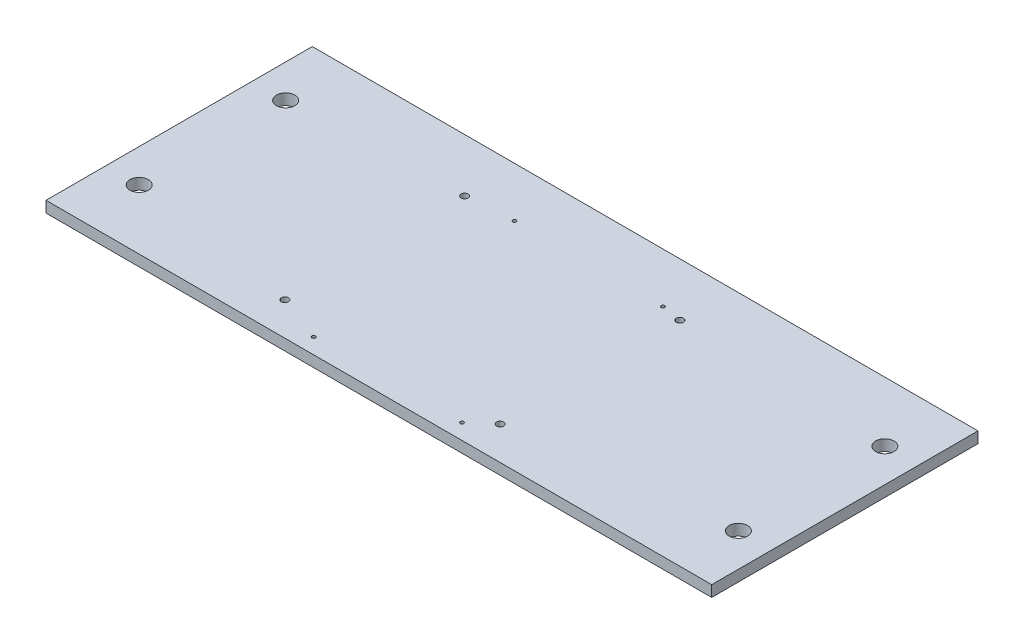
ISO-10303-21;
HEADER;
FILE_DESCRIPTION(('STEP AP214'),'2;1');
FILE_NAME('part.step','',(''),(''),'','','');
FILE_SCHEMA(('AUTOMOTIVE_DESIGN { 1 0 10303 214 1 1 1 1 }'));
ENDSEC;
DATA;
#1=APPLICATION_CONTEXT('core data for automotive mechanical design processes');
#2=APPLICATION_PROTOCOL_DEFINITION('international standard','automotive_design',2000,#1);
#3=PRODUCT_CONTEXT('',#1,'mechanical');
#4=PRODUCT('Part','Part','',(#3));
#5=PRODUCT_RELATED_PRODUCT_CATEGORY('part','',(#4));
#6=PRODUCT_DEFINITION_FORMATION('','',#4);
#7=PRODUCT_DEFINITION_CONTEXT('part definition',#1,'design');
#8=PRODUCT_DEFINITION('design','',#6,#7);
#9=PRODUCT_DEFINITION_SHAPE('','',#8);
#10=(LENGTH_UNIT() NAMED_UNIT(*) SI_UNIT(.MILLI.,.METRE.));
#11=(NAMED_UNIT(*) PLANE_ANGLE_UNIT() SI_UNIT($,.RADIAN.));
#12=(NAMED_UNIT(*) SI_UNIT($,.STERADIAN.) SOLID_ANGLE_UNIT());
#13=UNCERTAINTY_MEASURE_WITH_UNIT(LENGTH_MEASURE(1.E-05),#10,'distance_accuracy_value','');
#14=(GEOMETRIC_REPRESENTATION_CONTEXT(3) GLOBAL_UNCERTAINTY_ASSIGNED_CONTEXT((#13)) GLOBAL_UNIT_ASSIGNED_CONTEXT((#10,
#11,#12)) REPRESENTATION_CONTEXT('',''));
#15=CARTESIAN_POINT('',(0.,0.,0.));
#16=DIRECTION('',(0.,0.,1.));
#17=DIRECTION('',(1.,0.,0.));
#18=AXIS2_PLACEMENT_3D('',#15,#16,#17);
#19=CARTESIAN_POINT('',(0.,5.,0.));
#20=DIRECTION('',(0.,1.,0.));
#21=DIRECTION('',(0.,0.,1.));
#22=AXIS2_PLACEMENT_3D('',#19,#20,#21);
#23=PLANE('',#22);
#24=CARTESIAN_POINT('',(285.,5.,27.));
#25=DIRECTION('',(0.,-1.,0.));
#26=DIRECTION('',(0.,0.,-1.));
#27=AXIS2_PLACEMENT_3D('',#24,#25,#26);
#28=CIRCLE('',#27,4.15000000000001);
#29=CARTESIAN_POINT('',(285.,5.,22.85));
#30=VERTEX_POINT('',#29);
#31=EDGE_CURVE('E169',#30,#30,#28,.T.);
#32=ORIENTED_EDGE('',*,*,#31,.T.);
#33=EDGE_LOOP('',(#32));
#34=FACE_BOUND('',#33,.T.);
#35=CARTESIAN_POINT('',(285.,5.,93.));
#36=DIRECTION('',(0.,1.,0.));
#37=DIRECTION('',(0.,0.,1.));
#38=AXIS2_PLACEMENT_3D('',#35,#36,#37);
#39=CIRCLE('',#38,4.15000000000001);
#40=CARTESIAN_POINT('',(285.,5.,97.15));
#41=VERTEX_POINT('',#40);
#42=EDGE_CURVE('E170',#41,#41,#39,.T.);
#43=ORIENTED_EDGE('',*,*,#42,.F.);
#44=EDGE_LOOP('',(#43));
#45=FACE_BOUND('',#44,.T.);
#46=CARTESIAN_POINT('',(15.,5.,27.));
#47=DIRECTION('',(0.,1.,0.));
#48=DIRECTION('',(0.,0.,1.));
#49=AXIS2_PLACEMENT_3D('',#46,#47,#48);
#50=CIRCLE('',#49,4.15);
#51=CARTESIAN_POINT('',(15.,5.,31.15));
#52=VERTEX_POINT('',#51);
#53=EDGE_CURVE('E160',#52,#52,#50,.T.);
#54=ORIENTED_EDGE('',*,*,#53,.F.);
#55=EDGE_LOOP('',(#54));
#56=FACE_BOUND('',#55,.T.);
#57=CARTESIAN_POINT('',(92.6418942759896,5.,105.));
#58=DIRECTION('',(0.,1.,0.));
#59=DIRECTION('',(0.,0.,1.));
#60=AXIS2_PLACEMENT_3D('',#57,#58,#59);
#61=CIRCLE('',#60,1.6);
#62=CARTESIAN_POINT('',(92.6418942759896,5.,106.6));
#63=VERTEX_POINT('',#62);
#64=EDGE_CURVE('E156',#63,#63,#61,.T.);
#65=ORIENTED_EDGE('',*,*,#64,.F.);
#66=EDGE_LOOP('',(#65));
#67=FACE_BOUND('',#66,.T.);
#68=CARTESIAN_POINT('',(92.6418942759896,5.,24.));
#69=DIRECTION('',(0.,1.,0.));
#70=DIRECTION('',(0.,0.,1.));
#71=AXIS2_PLACEMENT_3D('',#68,#69,#70);
#72=CIRCLE('',#71,1.6);
#73=CARTESIAN_POINT('',(92.6418942759896,5.,25.6));
#74=VERTEX_POINT('',#73);
#75=EDGE_CURVE('E150',#74,#74,#72,.T.);
#76=ORIENTED_EDGE('',*,*,#75,.F.);
#77=EDGE_LOOP('',(#76));
#78=FACE_BOUND('',#77,.T.);
#79=CARTESIAN_POINT('',(189.64189427599,5.,24.));
#80=DIRECTION('',(0.,1.,0.));
#81=DIRECTION('',(0.,0.,1.));
#82=AXIS2_PLACEMENT_3D('',#79,#80,#81);
#83=CIRCLE('',#82,1.59999999999999);
#84=CARTESIAN_POINT('',(189.64189427599,5.,25.6));
#85=VERTEX_POINT('',#84);
#86=EDGE_CURVE('E144',#85,#85,#83,.T.);
#87=ORIENTED_EDGE('',*,*,#86,.F.);
#88=EDGE_LOOP('',(#87));
#89=FACE_BOUND('',#88,.T.);
#90=CARTESIAN_POINT('',(189.64189427599,5.,105.));
#91=DIRECTION('',(0.,1.,0.));
#92=DIRECTION('',(0.,0.,1.));
#93=AXIS2_PLACEMENT_3D('',#90,#91,#92);
#94=CIRCLE('',#93,1.59999999999999);
#95=CARTESIAN_POINT('',(189.64189427599,5.,106.6));
#96=VERTEX_POINT('',#95);
#97=EDGE_CURVE('E138',#96,#96,#94,.T.);
#98=ORIENTED_EDGE('',*,*,#97,.F.);
#99=EDGE_LOOP('',(#98));
#100=FACE_BOUND('',#99,.T.);
#101=CARTESIAN_POINT('',(113.64189427599,5.,112.9946));
#102=DIRECTION('',(0.,1.,0.));
#103=DIRECTION('',(0.,0.,1.));
#104=AXIS2_PLACEMENT_3D('',#101,#102,#103);
#105=CIRCLE('',#104,0.799999999999995);
#106=CARTESIAN_POINT('',(113.64189427599,5.,113.7946));
#107=VERTEX_POINT('',#106);
#108=EDGE_CURVE('E132',#107,#107,#105,.T.);
#109=ORIENTED_EDGE('',*,*,#108,.F.);
#110=EDGE_LOOP('',(#109));
#111=FACE_BOUND('',#110,.T.);
#112=CARTESIAN_POINT('',(180.47449427599,5.,112.9946));
#113=DIRECTION('',(0.,1.,0.));
#114=DIRECTION('',(0.,0.,1.));
#115=AXIS2_PLACEMENT_3D('',#112,#113,#114);
#116=CIRCLE('',#115,0.799999999999995);
#117=CARTESIAN_POINT('',(180.47449427599,5.,113.7946));
#118=VERTEX_POINT('',#117);
#119=EDGE_CURVE('E126',#118,#118,#116,.T.);
#120=ORIENTED_EDGE('',*,*,#119,.F.);
#121=EDGE_LOOP('',(#120));
#122=FACE_BOUND('',#121,.T.);
#123=CARTESIAN_POINT('',(180.47449427599,5.,22.4976));
#124=DIRECTION('',(0.,1.,0.));
#125=DIRECTION('',(0.,0.,1.));
#126=AXIS2_PLACEMENT_3D('',#123,#124,#125);
#127=CIRCLE('',#126,0.799999999999995);
#128=CARTESIAN_POINT('',(180.47449427599,5.,23.2976));
#129=VERTEX_POINT('',#128);
#130=EDGE_CURVE('E120',#129,#129,#127,.T.);
#131=ORIENTED_EDGE('',*,*,#130,.F.);
#132=EDGE_LOOP('',(#131));
#133=FACE_BOUND('',#132,.T.);
#134=CARTESIAN_POINT('',(113.64189427599,5.,22.4976));
#135=DIRECTION('',(0.,1.,0.));
#136=DIRECTION('',(0.,0.,1.));
#137=AXIS2_PLACEMENT_3D('',#134,#135,#136);
#138=CIRCLE('',#137,0.799999999999995);
#139=CARTESIAN_POINT('',(113.64189427599,5.,23.2976));
#140=VERTEX_POINT('',#139);
#141=EDGE_CURVE('E114',#140,#140,#138,.T.);
#142=ORIENTED_EDGE('',*,*,#141,.F.);
#143=EDGE_LOOP('',(#142));
#144=FACE_BOUND('',#143,.T.);
#145=DIRECTION('',(0.,0.,1.));
#146=VECTOR('',#145,1.);
#147=CARTESIAN_POINT('',(0.,5.,0.));
#148=LINE('',#147,#146);
#149=CARTESIAN_POINT('',(0.,5.,0.));
#150=VERTEX_POINT('',#149);
#151=CARTESIAN_POINT('',(0.,5.,120.));
#152=VERTEX_POINT('',#151);
#153=EDGE_CURVE('E85',#150,#152,#148,.T.);
#154=ORIENTED_EDGE('',*,*,#153,.T.);
#155=DIRECTION('',(1.,0.,0.));
#156=VECTOR('',#155,1.);
#157=CARTESIAN_POINT('',(0.,5.,120.));
#158=LINE('',#157,#156);
#159=CARTESIAN_POINT('',(300.,5.,120.));
#160=VERTEX_POINT('',#159);
#161=EDGE_CURVE('E80',#152,#160,#158,.T.);
#162=ORIENTED_EDGE('',*,*,#161,.T.);
#163=DIRECTION('',(0.,0.,-1.));
#164=VECTOR('',#163,1.);
#165=CARTESIAN_POINT('',(300.,5.,0.));
#166=LINE('',#165,#164);
#167=CARTESIAN_POINT('',(300.,5.,0.));
#168=VERTEX_POINT('',#167);
#169=EDGE_CURVE('E83',#160,#168,#166,.T.);
#170=ORIENTED_EDGE('',*,*,#169,.T.);
#171=DIRECTION('',(-1.,0.,0.));
#172=VECTOR('',#171,1.);
#173=CARTESIAN_POINT('',(0.,5.,0.));
#174=LINE('',#173,#172);
#175=EDGE_CURVE('E50',#168,#150,#174,.T.);
#176=ORIENTED_EDGE('',*,*,#175,.T.);
#177=EDGE_LOOP('',(#154,#162,#170,#176));
#178=FACE_BOUND('',#177,.T.);
#179=CARTESIAN_POINT('',(15.,5.,93.));
#180=DIRECTION('',(0.,-1.,0.));
#181=DIRECTION('',(0.,0.,-1.));
#182=AXIS2_PLACEMENT_3D('',#179,#180,#181);
#183=CIRCLE('',#182,4.15);
#184=CARTESIAN_POINT('',(15.,5.,88.85));
#185=VERTEX_POINT('',#184);
#186=EDGE_CURVE('E163',#185,#185,#183,.T.);
#187=ORIENTED_EDGE('',*,*,#186,.T.);
#188=EDGE_LOOP('',(#187));
#189=FACE_BOUND('',#188,.T.);
#190=ADVANCED_FACE('F33',(#34,#45,#56,#67,#78,#89,#100,#111,#122,#133,#144,#178,#189),#23,.T.);
#191=CARTESIAN_POINT('',(0.,0.,0.));
#192=DIRECTION('',(0.,1.,0.));
#193=DIRECTION('',(0.,0.,1.));
#194=AXIS2_PLACEMENT_3D('',#191,#192,#193);
#195=PLANE('',#194);
#196=CARTESIAN_POINT('',(285.,0.,93.));
#197=DIRECTION('',(0.,1.,0.));
#198=DIRECTION('',(0.,0.,1.));
#199=AXIS2_PLACEMENT_3D('',#196,#197,#198);
#200=CIRCLE('',#199,4.15000000000001);
#201=CARTESIAN_POINT('',(285.,0.,97.15));
#202=VERTEX_POINT('',#201);
#203=EDGE_CURVE('E178',#202,#202,#200,.T.);
#204=ORIENTED_EDGE('',*,*,#203,.T.);
#205=EDGE_LOOP('',(#204));
#206=FACE_BOUND('',#205,.T.);
#207=CARTESIAN_POINT('',(15.,0.,27.));
#208=DIRECTION('',(0.,1.,0.));
#209=DIRECTION('',(0.,0.,1.));
#210=AXIS2_PLACEMENT_3D('',#207,#208,#209);
#211=CIRCLE('',#210,4.15);
#212=CARTESIAN_POINT('',(15.,0.,31.15));
#213=VERTEX_POINT('',#212);
#214=EDGE_CURVE('E159',#213,#213,#211,.T.);
#215=ORIENTED_EDGE('',*,*,#214,.T.);
#216=EDGE_LOOP('',(#215));
#217=FACE_BOUND('',#216,.T.);
#218=CARTESIAN_POINT('',(92.6418942759896,0.,105.));
#219=DIRECTION('',(0.,1.,0.));
#220=DIRECTION('',(0.,0.,1.));
#221=AXIS2_PLACEMENT_3D('',#218,#219,#220);
#222=CIRCLE('',#221,1.6);
#223=CARTESIAN_POINT('',(92.6418942759896,0.,106.6));
#224=VERTEX_POINT('',#223);
#225=EDGE_CURVE('E153',#224,#224,#222,.T.);
#226=ORIENTED_EDGE('',*,*,#225,.T.);
#227=EDGE_LOOP('',(#226));
#228=FACE_BOUND('',#227,.T.);
#229=CARTESIAN_POINT('',(92.6418942759896,0.,24.));
#230=DIRECTION('',(0.,1.,0.));
#231=DIRECTION('',(0.,0.,1.));
#232=AXIS2_PLACEMENT_3D('',#229,#230,#231);
#233=CIRCLE('',#232,1.6);
#234=CARTESIAN_POINT('',(92.6418942759896,0.,25.6));
#235=VERTEX_POINT('',#234);
#236=EDGE_CURVE('E147',#235,#235,#233,.T.);
#237=ORIENTED_EDGE('',*,*,#236,.T.);
#238=EDGE_LOOP('',(#237));
#239=FACE_BOUND('',#238,.T.);
#240=CARTESIAN_POINT('',(189.64189427599,0.,24.));
#241=DIRECTION('',(0.,1.,0.));
#242=DIRECTION('',(0.,0.,1.));
#243=AXIS2_PLACEMENT_3D('',#240,#241,#242);
#244=CIRCLE('',#243,1.59999999999999);
#245=CARTESIAN_POINT('',(189.64189427599,0.,25.6));
#246=VERTEX_POINT('',#245);
#247=EDGE_CURVE('E141',#246,#246,#244,.T.);
#248=ORIENTED_EDGE('',*,*,#247,.T.);
#249=EDGE_LOOP('',(#248));
#250=FACE_BOUND('',#249,.T.);
#251=CARTESIAN_POINT('',(189.64189427599,0.,105.));
#252=DIRECTION('',(0.,1.,0.));
#253=DIRECTION('',(0.,0.,1.));
#254=AXIS2_PLACEMENT_3D('',#251,#252,#253);
#255=CIRCLE('',#254,1.59999999999999);
#256=CARTESIAN_POINT('',(189.64189427599,0.,106.6));
#257=VERTEX_POINT('',#256);
#258=EDGE_CURVE('E135',#257,#257,#255,.T.);
#259=ORIENTED_EDGE('',*,*,#258,.T.);
#260=EDGE_LOOP('',(#259));
#261=FACE_BOUND('',#260,.T.);
#262=CARTESIAN_POINT('',(113.64189427599,0.,112.9946));
#263=DIRECTION('',(0.,1.,0.));
#264=DIRECTION('',(0.,0.,1.));
#265=AXIS2_PLACEMENT_3D('',#262,#263,#264);
#266=CIRCLE('',#265,0.799999999999995);
#267=CARTESIAN_POINT('',(113.64189427599,0.,113.7946));
#268=VERTEX_POINT('',#267);
#269=EDGE_CURVE('E129',#268,#268,#266,.T.);
#270=ORIENTED_EDGE('',*,*,#269,.T.);
#271=EDGE_LOOP('',(#270));
#272=FACE_BOUND('',#271,.T.);
#273=CARTESIAN_POINT('',(180.47449427599,0.,112.9946));
#274=DIRECTION('',(0.,1.,0.));
#275=DIRECTION('',(0.,0.,1.));
#276=AXIS2_PLACEMENT_3D('',#273,#274,#275);
#277=CIRCLE('',#276,0.799999999999995);
#278=CARTESIAN_POINT('',(180.47449427599,0.,113.7946));
#279=VERTEX_POINT('',#278);
#280=EDGE_CURVE('E123',#279,#279,#277,.T.);
#281=ORIENTED_EDGE('',*,*,#280,.T.);
#282=EDGE_LOOP('',(#281));
#283=FACE_BOUND('',#282,.T.);
#284=CARTESIAN_POINT('',(180.47449427599,0.,22.4976));
#285=DIRECTION('',(0.,1.,0.));
#286=DIRECTION('',(0.,0.,1.));
#287=AXIS2_PLACEMENT_3D('',#284,#285,#286);
#288=CIRCLE('',#287,0.799999999999995);
#289=CARTESIAN_POINT('',(180.47449427599,0.,23.2976));
#290=VERTEX_POINT('',#289);
#291=EDGE_CURVE('E117',#290,#290,#288,.T.);
#292=ORIENTED_EDGE('',*,*,#291,.T.);
#293=EDGE_LOOP('',(#292));
#294=FACE_BOUND('',#293,.T.);
#295=CARTESIAN_POINT('',(113.64189427599,0.,22.4976));
#296=DIRECTION('',(0.,1.,0.));
#297=DIRECTION('',(0.,0.,1.));
#298=AXIS2_PLACEMENT_3D('',#295,#296,#297);
#299=CIRCLE('',#298,0.799999999999995);
#300=CARTESIAN_POINT('',(113.64189427599,0.,23.2976));
#301=VERTEX_POINT('',#300);
#302=EDGE_CURVE('E100',#301,#301,#299,.T.);
#303=ORIENTED_EDGE('',*,*,#302,.T.);
#304=EDGE_LOOP('',(#303));
#305=FACE_BOUND('',#304,.T.);
#306=DIRECTION('',(0.,0.,1.));
#307=VECTOR('',#306,1.);
#308=CARTESIAN_POINT('',(0.,0.,0.));
#309=LINE('',#308,#307);
#310=CARTESIAN_POINT('',(0.,0.,0.));
#311=VERTEX_POINT('',#310);
#312=CARTESIAN_POINT('',(0.,0.,120.));
#313=VERTEX_POINT('',#312);
#314=EDGE_CURVE('E97',#311,#313,#309,.T.);
#315=ORIENTED_EDGE('',*,*,#314,.F.);
#316=DIRECTION('',(-1.,0.,0.));
#317=VECTOR('',#316,1.);
#318=CARTESIAN_POINT('',(0.,0.,0.));
#319=LINE('',#318,#317);
#320=CARTESIAN_POINT('',(300.,0.,0.));
#321=VERTEX_POINT('',#320);
#322=EDGE_CURVE('E73',#321,#311,#319,.T.);
#323=ORIENTED_EDGE('',*,*,#322,.F.);
#324=DIRECTION('',(0.,0.,-1.));
#325=VECTOR('',#324,1.);
#326=CARTESIAN_POINT('',(300.,0.,0.));
#327=LINE('',#326,#325);
#328=CARTESIAN_POINT('',(300.,0.,120.));
#329=VERTEX_POINT('',#328);
#330=EDGE_CURVE('E67',#329,#321,#327,.T.);
#331=ORIENTED_EDGE('',*,*,#330,.F.);
#332=DIRECTION('',(1.,0.,0.));
#333=VECTOR('',#332,1.);
#334=CARTESIAN_POINT('',(0.,0.,120.));
#335=LINE('',#334,#333);
#336=EDGE_CURVE('E89',#313,#329,#335,.T.);
#337=ORIENTED_EDGE('',*,*,#336,.F.);
#338=EDGE_LOOP('',(#315,#323,#331,#337));
#339=FACE_BOUND('',#338,.T.);
#340=CARTESIAN_POINT('',(285.,0.,27.));
#341=DIRECTION('',(0.,-1.,0.));
#342=DIRECTION('',(0.,0.,-1.));
#343=AXIS2_PLACEMENT_3D('',#340,#341,#342);
#344=CIRCLE('',#343,4.15000000000001);
#345=CARTESIAN_POINT('',(285.,0.,22.85));
#346=VERTEX_POINT('',#345);
#347=EDGE_CURVE('E166',#346,#346,#344,.T.);
#348=ORIENTED_EDGE('',*,*,#347,.F.);
#349=EDGE_LOOP('',(#348));
#350=FACE_BOUND('',#349,.T.);
#351=CARTESIAN_POINT('',(15.,0.,93.));
#352=DIRECTION('',(0.,-1.,0.));
#353=DIRECTION('',(0.,0.,-1.));
#354=AXIS2_PLACEMENT_3D('',#351,#352,#353);
#355=CIRCLE('',#354,4.15);
#356=CARTESIAN_POINT('',(15.,0.,88.85));
#357=VERTEX_POINT('',#356);
#358=EDGE_CURVE('E173',#357,#357,#355,.T.);
#359=ORIENTED_EDGE('',*,*,#358,.F.);
#360=EDGE_LOOP('',(#359));
#361=FACE_BOUND('',#360,.T.);
#362=ADVANCED_FACE('F108',(#206,#217,#228,#239,#250,#261,#272,#283,#294,#305,#339,#350,#361),
#195,.F.);
#363=CARTESIAN_POINT('',(0.,5.,0.));
#364=DIRECTION('',(1.,0.,0.));
#365=DIRECTION('',(0.,0.,-1.));
#366=AXIS2_PLACEMENT_3D('',#363,#364,#365);
#367=PLANE('',#366);
#368=ORIENTED_EDGE('',*,*,#314,.T.);
#369=DIRECTION('',(0.,-1.,0.));
#370=VECTOR('',#369,1.);
#371=CARTESIAN_POINT('',(0.,5.,120.));
#372=LINE('',#371,#370);
#373=EDGE_CURVE('E11',#152,#313,#372,.T.);
#374=ORIENTED_EDGE('',*,*,#373,.F.);
#375=ORIENTED_EDGE('',*,*,#153,.F.);
#376=DIRECTION('',(0.,-1.,0.));
#377=VECTOR('',#376,1.);
#378=CARTESIAN_POINT('',(0.,5.,0.));
#379=LINE('',#378,#377);
#380=EDGE_CURVE('E93',#150,#311,#379,.T.);
#381=ORIENTED_EDGE('',*,*,#380,.T.);
#382=EDGE_LOOP('',(#368,#374,#375,#381));
#383=FACE_BOUND('',#382,.T.);
#384=ADVANCED_FACE('F35',(#383),#367,.F.);
#385=CARTESIAN_POINT('',(0.,5.,120.));
#386=DIRECTION('',(0.,0.,-1.));
#387=DIRECTION('',(-1.,0.,0.));
#388=AXIS2_PLACEMENT_3D('',#385,#386,#387);
#389=PLANE('',#388);
#390=ORIENTED_EDGE('',*,*,#336,.T.);
#391=DIRECTION('',(0.,-1.,0.));
#392=VECTOR('',#391,1.);
#393=CARTESIAN_POINT('',(300.,5.,120.));
#394=LINE('',#393,#392);
#395=EDGE_CURVE('E42',#160,#329,#394,.T.);
#396=ORIENTED_EDGE('',*,*,#395,.F.);
#397=ORIENTED_EDGE('',*,*,#161,.F.);
#398=ORIENTED_EDGE('',*,*,#373,.T.);
#399=EDGE_LOOP('',(#390,#396,#397,#398));
#400=FACE_BOUND('',#399,.T.);
#401=ADVANCED_FACE('F88',(#400),#389,.F.);
#402=CARTESIAN_POINT('',(300.,5.,0.));
#403=DIRECTION('',(-1.,0.,0.));
#404=DIRECTION('',(0.,0.,1.));
#405=AXIS2_PLACEMENT_3D('',#402,#403,#404);
#406=PLANE('',#405);
#407=ORIENTED_EDGE('',*,*,#330,.T.);
#408=DIRECTION('',(0.,-1.,0.));
#409=VECTOR('',#408,1.);
#410=CARTESIAN_POINT('',(300.,5.,0.));
#411=LINE('',#410,#409);
#412=EDGE_CURVE('E90',#168,#321,#411,.T.);
#413=ORIENTED_EDGE('',*,*,#412,.F.);
#414=ORIENTED_EDGE('',*,*,#169,.F.);
#415=ORIENTED_EDGE('',*,*,#395,.T.);
#416=EDGE_LOOP('',(#407,#413,#414,#415));
#417=FACE_BOUND('',#416,.T.);
#418=ADVANCED_FACE('F91',(#417),#406,.F.);
#419=CARTESIAN_POINT('',(0.,5.,0.));
#420=DIRECTION('',(0.,0.,1.));
#421=DIRECTION('',(1.,0.,0.));
#422=AXIS2_PLACEMENT_3D('',#419,#420,#421);
#423=PLANE('',#422);
#424=ORIENTED_EDGE('',*,*,#322,.T.);
#425=ORIENTED_EDGE('',*,*,#380,.F.);
#426=ORIENTED_EDGE('',*,*,#175,.F.);
#427=ORIENTED_EDGE('',*,*,#412,.T.);
#428=EDGE_LOOP('',(#424,#425,#426,#427));
#429=FACE_BOUND('',#428,.T.);
#430=ADVANCED_FACE('F105',(#429),#423,.F.);
#431=CARTESIAN_POINT('',(113.64189427599,5.,22.4976));
#432=DIRECTION('',(0.,1.,0.));
#433=DIRECTION('',(0.,0.,1.));
#434=AXIS2_PLACEMENT_3D('',#431,#432,#433);
#435=CYLINDRICAL_SURFACE('',#434,0.799999999999995);
#436=ORIENTED_EDGE('',*,*,#302,.F.);
#437=EDGE_LOOP('',(#436));
#438=FACE_BOUND('',#437,.T.);
#439=ORIENTED_EDGE('',*,*,#141,.T.);
#440=EDGE_LOOP('',(#439));
#441=FACE_BOUND('',#440,.T.);
#442=ADVANCED_FACE('F208',(#438,#441),#435,.F.);
#443=CARTESIAN_POINT('',(180.47449427599,5.,22.4976));
#444=DIRECTION('',(0.,1.,0.));
#445=DIRECTION('',(0.,0.,1.));
#446=AXIS2_PLACEMENT_3D('',#443,#444,#445);
#447=CYLINDRICAL_SURFACE('',#446,0.799999999999995);
#448=ORIENTED_EDGE('',*,*,#291,.F.);
#449=EDGE_LOOP('',(#448));
#450=FACE_BOUND('',#449,.T.);
#451=ORIENTED_EDGE('',*,*,#130,.T.);
#452=EDGE_LOOP('',(#451));
#453=FACE_BOUND('',#452,.T.);
#454=ADVANCED_FACE('F210',(#450,#453),#447,.F.);
#455=CARTESIAN_POINT('',(180.47449427599,5.,112.9946));
#456=DIRECTION('',(0.,1.,0.));
#457=DIRECTION('',(0.,0.,1.));
#458=AXIS2_PLACEMENT_3D('',#455,#456,#457);
#459=CYLINDRICAL_SURFACE('',#458,0.799999999999995);
#460=ORIENTED_EDGE('',*,*,#280,.F.);
#461=EDGE_LOOP('',(#460));
#462=FACE_BOUND('',#461,.T.);
#463=ORIENTED_EDGE('',*,*,#119,.T.);
#464=EDGE_LOOP('',(#463));
#465=FACE_BOUND('',#464,.T.);
#466=ADVANCED_FACE('F217',(#462,#465),#459,.F.);
#467=CARTESIAN_POINT('',(113.64189427599,5.,112.9946));
#468=DIRECTION('',(0.,1.,0.));
#469=DIRECTION('',(0.,0.,1.));
#470=AXIS2_PLACEMENT_3D('',#467,#468,#469);
#471=CYLINDRICAL_SURFACE('',#470,0.799999999999995);
#472=ORIENTED_EDGE('',*,*,#269,.F.);
#473=EDGE_LOOP('',(#472));
#474=FACE_BOUND('',#473,.T.);
#475=ORIENTED_EDGE('',*,*,#108,.T.);
#476=EDGE_LOOP('',(#475));
#477=FACE_BOUND('',#476,.T.);
#478=ADVANCED_FACE('F286',(#474,#477),#471,.F.);
#479=CARTESIAN_POINT('',(189.64189427599,5.,105.));
#480=DIRECTION('',(0.,1.,0.));
#481=DIRECTION('',(0.,0.,1.));
#482=AXIS2_PLACEMENT_3D('',#479,#480,#481);
#483=CYLINDRICAL_SURFACE('',#482,1.59999999999999);
#484=ORIENTED_EDGE('',*,*,#258,.F.);
#485=EDGE_LOOP('',(#484));
#486=FACE_BOUND('',#485,.T.);
#487=ORIENTED_EDGE('',*,*,#97,.T.);
#488=EDGE_LOOP('',(#487));
#489=FACE_BOUND('',#488,.T.);
#490=ADVANCED_FACE('F276',(#486,#489),#483,.F.);
#491=CARTESIAN_POINT('',(189.64189427599,5.,24.));
#492=DIRECTION('',(0.,1.,0.));
#493=DIRECTION('',(0.,0.,1.));
#494=AXIS2_PLACEMENT_3D('',#491,#492,#493);
#495=CYLINDRICAL_SURFACE('',#494,1.59999999999999);
#496=ORIENTED_EDGE('',*,*,#247,.F.);
#497=EDGE_LOOP('',(#496));
#498=FACE_BOUND('',#497,.T.);
#499=ORIENTED_EDGE('',*,*,#86,.T.);
#500=EDGE_LOOP('',(#499));
#501=FACE_BOUND('',#500,.T.);
#502=ADVANCED_FACE('F266',(#498,#501),#495,.F.);
#503=CARTESIAN_POINT('',(92.6418942759896,5.,24.));
#504=DIRECTION('',(0.,1.,0.));
#505=DIRECTION('',(0.,0.,1.));
#506=AXIS2_PLACEMENT_3D('',#503,#504,#505);
#507=CYLINDRICAL_SURFACE('',#506,1.6);
#508=ORIENTED_EDGE('',*,*,#236,.F.);
#509=EDGE_LOOP('',(#508));
#510=FACE_BOUND('',#509,.T.);
#511=ORIENTED_EDGE('',*,*,#75,.T.);
#512=EDGE_LOOP('',(#511));
#513=FACE_BOUND('',#512,.T.);
#514=ADVANCED_FACE('F255',(#510,#513),#507,.F.);
#515=CARTESIAN_POINT('',(92.6418942759896,5.,105.));
#516=DIRECTION('',(0.,1.,0.));
#517=DIRECTION('',(0.,0.,1.));
#518=AXIS2_PLACEMENT_3D('',#515,#516,#517);
#519=CYLINDRICAL_SURFACE('',#518,1.6);
#520=ORIENTED_EDGE('',*,*,#225,.F.);
#521=EDGE_LOOP('',(#520));
#522=FACE_BOUND('',#521,.T.);
#523=ORIENTED_EDGE('',*,*,#64,.T.);
#524=EDGE_LOOP('',(#523));
#525=FACE_BOUND('',#524,.T.);
#526=ADVANCED_FACE('F249',(#522,#525),#519,.F.);
#527=CARTESIAN_POINT('',(15.,0.,27.));
#528=DIRECTION('',(0.,1.,0.));
#529=DIRECTION('',(0.,0.,1.));
#530=AXIS2_PLACEMENT_3D('',#527,#528,#529);
#531=CYLINDRICAL_SURFACE('',#530,4.15);
#532=ORIENTED_EDGE('',*,*,#214,.F.);
#533=EDGE_LOOP('',(#532));
#534=FACE_BOUND('',#533,.T.);
#535=ORIENTED_EDGE('',*,*,#53,.T.);
#536=EDGE_LOOP('',(#535));
#537=FACE_BOUND('',#536,.T.);
#538=ADVANCED_FACE('F254',(#534,#537),#531,.F.);
#539=CARTESIAN_POINT('',(285.,0.,93.));
#540=DIRECTION('',(0.,1.,0.));
#541=DIRECTION('',(0.,0.,1.));
#542=AXIS2_PLACEMENT_3D('',#539,#540,#541);
#543=CYLINDRICAL_SURFACE('',#542,4.15000000000001);
#544=ORIENTED_EDGE('',*,*,#203,.F.);
#545=EDGE_LOOP('',(#544));
#546=FACE_BOUND('',#545,.T.);
#547=ORIENTED_EDGE('',*,*,#42,.T.);
#548=EDGE_LOOP('',(#547));
#549=FACE_BOUND('',#548,.T.);
#550=ADVANCED_FACE('F184',(#546,#549),#543,.F.);
#551=CARTESIAN_POINT('',(285.,0.,27.));
#552=DIRECTION('',(0.,1.,0.));
#553=DIRECTION('',(0.,0.,1.));
#554=AXIS2_PLACEMENT_3D('',#551,#552,#553);
#555=CYLINDRICAL_SURFACE('',#554,4.15000000000001);
#556=ORIENTED_EDGE('',*,*,#347,.T.);
#557=EDGE_LOOP('',(#556));
#558=FACE_BOUND('',#557,.T.);
#559=ORIENTED_EDGE('',*,*,#31,.F.);
#560=EDGE_LOOP('',(#559));
#561=FACE_BOUND('',#560,.T.);
#562=ADVANCED_FACE('F341',(#558,#561),#555,.F.);
#563=CARTESIAN_POINT('',(15.,0.,93.));
#564=DIRECTION('',(0.,1.,0.));
#565=DIRECTION('',(0.,0.,1.));
#566=AXIS2_PLACEMENT_3D('',#563,#564,#565);
#567=CYLINDRICAL_SURFACE('',#566,4.15);
#568=ORIENTED_EDGE('',*,*,#358,.T.);
#569=EDGE_LOOP('',(#568));
#570=FACE_BOUND('',#569,.T.);
#571=ORIENTED_EDGE('',*,*,#186,.F.);
#572=EDGE_LOOP('',(#571));
#573=FACE_BOUND('',#572,.T.);
#574=ADVANCED_FACE('F344',(#570,#573),#567,.F.);
#575=CLOSED_SHELL('',(#190,#362,#384,#401,#418,#430,#442,#454,#466,#478,#490,#502,#514,#526,
#538,#550,#562,#574));
#576=MANIFOLD_SOLID_BREP('B2',#575);
#577=ADVANCED_BREP_SHAPE_REPRESENTATION('',(#18,#576),#14);
#578=SHAPE_DEFINITION_REPRESENTATION(#9,#577);
ENDSEC;
END-ISO-10303-21;
